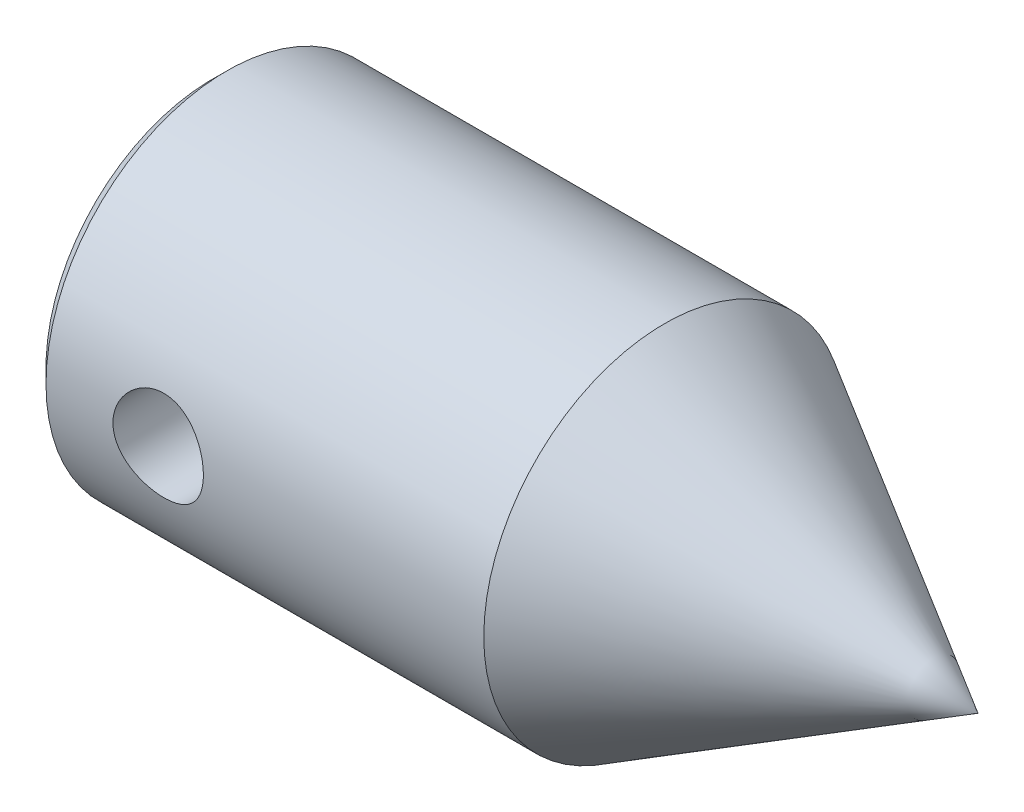
ISO-10303-21;
HEADER;
FILE_DESCRIPTION(('STEP AP214'),'2;1');
FILE_NAME('part.step','',(''),(''),'','','');
FILE_SCHEMA(('AUTOMOTIVE_DESIGN { 1 0 10303 214 1 1 1 1 }'));
ENDSEC;
DATA;
#1=APPLICATION_CONTEXT('core data for automotive mechanical design processes');
#2=APPLICATION_PROTOCOL_DEFINITION('international standard','automotive_design',2000,#1);
#3=PRODUCT_CONTEXT('',#1,'mechanical');
#4=PRODUCT('Part','Part','',(#3));
#5=PRODUCT_RELATED_PRODUCT_CATEGORY('part','',(#4));
#6=PRODUCT_DEFINITION_FORMATION('','',#4);
#7=PRODUCT_DEFINITION_CONTEXT('part definition',#1,'design');
#8=PRODUCT_DEFINITION('design','',#6,#7);
#9=PRODUCT_DEFINITION_SHAPE('','',#8);
#10=(LENGTH_UNIT() NAMED_UNIT(*) SI_UNIT(.MILLI.,.METRE.));
#11=(NAMED_UNIT(*) PLANE_ANGLE_UNIT() SI_UNIT($,.RADIAN.));
#12=(NAMED_UNIT(*) SI_UNIT($,.STERADIAN.) SOLID_ANGLE_UNIT());
#13=UNCERTAINTY_MEASURE_WITH_UNIT(LENGTH_MEASURE(1.E-05),#10,'distance_accuracy_value','');
#14=(GEOMETRIC_REPRESENTATION_CONTEXT(3) GLOBAL_UNCERTAINTY_ASSIGNED_CONTEXT((#13)) GLOBAL_UNIT_ASSIGNED_CONTEXT((#10,
#11,#12)) REPRESENTATION_CONTEXT('',''));
#15=CARTESIAN_POINT('',(0.,0.,0.));
#16=DIRECTION('',(0.,0.,1.));
#17=DIRECTION('',(1.,0.,0.));
#18=AXIS2_PLACEMENT_3D('',#15,#16,#17);
#19=CARTESIAN_POINT('',(0.,0.,0.));
#20=DIRECTION('',(-1.,0.,0.));
#21=DIRECTION('',(0.,0.,1.));
#22=AXIS2_PLACEMENT_3D('',#19,#20,#21);
#23=CYLINDRICAL_SURFACE('',#22,7.9375);
#24=CARTESIAN_POINT('',(1.016,0.,0.));
#25=DIRECTION('',(1.,0.,0.));
#26=DIRECTION('',(0.,0.,-1.));
#27=AXIS2_PLACEMENT_3D('',#24,#25,#26);
#28=CIRCLE('',#27,7.9375);
#29=CARTESIAN_POINT('',(1.016,0.,-7.9375));
#30=VERTEX_POINT('',#29);
#31=EDGE_CURVE('E11',#30,#30,#28,.F.);
#32=ORIENTED_EDGE('',*,*,#31,.T.);
#33=EDGE_LOOP('',(#32));
#34=FACE_BOUND('',#33,.T.);
#35=CARTESIAN_POINT('',(25.4,0.,0.));
#36=DIRECTION('',(-1.,0.,0.));
#37=DIRECTION('',(0.,0.,1.));
#38=AXIS2_PLACEMENT_3D('',#35,#36,#37);
#39=CIRCLE('',#38,7.9375);
#40=CARTESIAN_POINT('',(25.4,0.,7.9375));
#41=VERTEX_POINT('',#40);
#42=EDGE_CURVE('E93',#41,#41,#39,.T.);
#43=ORIENTED_EDGE('',*,*,#42,.F.);
#44=EDGE_LOOP('',(#43));
#45=FACE_BOUND('',#44,.T.);
#46=CARTESIAN_POINT('',(12.065,0.,7.9375));
#47=CARTESIAN_POINT('',(12.0649982950492,-0.0853685543276753,7.9374988249375));
#48=CARTESIAN_POINT('',(12.0615499555497,-0.170766754285778,7.93611748805491));
#49=CARTESIAN_POINT('',(12.0477990093693,-0.340937950036051,7.9306333870349));
#50=CARTESIAN_POINT('',(12.0374920778549,-0.425710517197598,7.92652890576471));
#51=CARTESIAN_POINT('',(11.996344710042,-0.678494093296387,7.91024405172601));
#52=CARTESIAN_POINT('',(11.9552780245151,-0.844717304002153,7.89409269398439));
#53=CARTESIAN_POINT('',(11.8477091089001,-1.16678110877374,7.85295460909391));
#54=CARTESIAN_POINT('',(11.7812901501931,-1.32265375288673,7.82799682735572));
#55=CARTESIAN_POINT('',(11.6252320937711,-1.62094055421135,7.77171078395473));
#56=CARTESIAN_POINT('',(11.5356010564021,-1.76335935985761,7.74038473446993));
#57=CARTESIAN_POINT('',(11.33120113708,-2.03756104036298,7.67287793546994));
#58=CARTESIAN_POINT('',(11.2155181808152,-2.16862471408353,7.63654649529086));
#59=CARTESIAN_POINT('',(10.9642274968852,-2.41010196326798,7.56381162683049));
#60=CARTESIAN_POINT('',(10.8286100788337,-2.52050543588591,7.527408172081));
#61=CARTESIAN_POINT('',(10.5339704378038,-2.72236362018853,7.45684932878625));
#62=CARTESIAN_POINT('',(10.374175203254,-2.81275634807416,7.42286609334558));
#63=CARTESIAN_POINT('',(10.0400859676923,-2.96506055107625,7.3633591466895));
#64=CARTESIAN_POINT('',(9.86579889959094,-3.02698555366352,7.3378314191484));
#65=CARTESIAN_POINT('',(9.5159316703746,-3.11768939850381,7.29974342844104));
#66=CARTESIAN_POINT('',(9.34076866350313,-3.14784417508583,7.28664754820722));
#67=CARTESIAN_POINT('',(8.98741694020683,-3.17844957223633,7.2733535642182));
#68=CARTESIAN_POINT('',(8.80922975481335,-3.17891479977946,7.27314911800113));
#69=CARTESIAN_POINT('',(8.46811128401985,-3.15117062195247,7.28520419164092));
#70=CARTESIAN_POINT('',(8.30498130325892,-3.12495456169026,7.29659727750813));
#71=CARTESIAN_POINT('',(7.98566545473029,-3.0479156721401,7.3291094770303));
#72=CARTESIAN_POINT('',(7.82948080384975,-2.99708854916464,7.35023028776914));
#73=CARTESIAN_POINT('',(7.52472168507455,-2.87130288801851,7.40028182612306));
#74=CARTESIAN_POINT('',(7.37636758301029,-2.79587303145073,7.42936314617456));
#75=CARTESIAN_POINT('',(7.0938773915164,-2.62335400638721,7.49201759759741));
#76=CARTESIAN_POINT('',(6.95974667007038,-2.52625670309061,7.52559241410194));
#77=CARTESIAN_POINT('',(6.6985995555297,-2.30433657664143,7.59661194581105));
#78=CARTESIAN_POINT('',(6.57293464200522,-2.1779507224679,7.63415518150378));
#79=CARTESIAN_POINT('',(6.34415089117099,-1.90549915354342,7.70667472120535));
#80=CARTESIAN_POINT('',(6.24103654411095,-1.75942952871787,7.74165051306754));
#81=CARTESIAN_POINT('',(6.05850730222758,-1.44792327351233,7.80597056507674));
#82=CARTESIAN_POINT('',(5.97960087859973,-1.28216103001268,7.83518991276525));
#83=CARTESIAN_POINT('',(5.85125852053853,-0.938250227703929,7.8837603997185));
#84=CARTESIAN_POINT('',(5.8018076153776,-0.760108012498826,7.90311655121518));
#85=CARTESIAN_POINT('',(5.73651333102123,-0.407822221577447,7.92886621467234));
#86=CARTESIAN_POINT('',(5.71885372887247,-0.234066229202029,7.93595926510707));
#87=CARTESIAN_POINT('',(5.71228045291082,0.1140544293199,7.93858709635623));
#88=CARTESIAN_POINT('',(5.72335932804335,0.288418925992912,7.93412487311887));
#89=CARTESIAN_POINT('',(5.77261315717626,0.624574473356217,7.91460137713708));
#90=CARTESIAN_POINT('',(5.80954829380709,0.786578455693803,7.90002533761017));
#91=CARTESIAN_POINT('',(5.9077791869419,1.10193999204625,7.86224363231233));
#92=CARTESIAN_POINT('',(5.96907807272432,1.25529643248105,7.839036858035));
#93=CARTESIAN_POINT('',(6.11629609174161,1.55428757248493,7.78536344198656));
#94=CARTESIAN_POINT('',(6.20291093686734,1.69954261112768,7.75469645367908));
#95=CARTESIAN_POINT('',(6.39753026420135,1.97396670110043,7.68942716533551));
#96=CARTESIAN_POINT('',(6.50554331814394,2.1031292721953,7.65482329062667));
#97=CARTESIAN_POINT('',(6.74825614555296,2.35064783082209,7.58261624250382));
#98=CARTESIAN_POINT('',(6.88424699712351,2.46772736997036,7.54496588261805));
#99=CARTESIAN_POINT('',(7.17461113179496,2.67771752584103,7.47302405756412));
#100=CARTESIAN_POINT('',(7.32898743810548,2.77062415967416,7.43873314650073));
#101=CARTESIAN_POINT('',(7.65407044010168,2.93021940951752,7.37733951101733));
#102=CARTESIAN_POINT('',(7.82492084850038,2.99664531957733,7.35030964023023));
#103=CARTESIAN_POINT('',(8.17678967234678,3.09927024802884,7.30763831652789));
#104=CARTESIAN_POINT('',(8.3578004776564,3.13549157555361,7.29198845941928));
#105=CARTESIAN_POINT('',(8.71081554320477,3.17454854503857,7.27506417865867));
#106=CARTESIAN_POINT('',(8.88253055474372,3.17959912756792,7.27283630768347));
#107=CARTESIAN_POINT('',(9.22423996473017,3.16198750594215,7.28051052284657));
#108=CARTESIAN_POINT('',(9.39423457889875,3.13932882078029,7.29041106871286));
#109=CARTESIAN_POINT('',(9.72078984027435,3.06875082741637,7.32038555119357));
#110=CARTESIAN_POINT('',(9.87761589492898,3.02186589429123,7.3400416945069));
#111=CARTESIAN_POINT('',(10.1812386152561,2.90513352619813,7.38701853032588));
#112=CARTESIAN_POINT('',(10.3280324975779,2.83527974968518,7.4143413392411));
#113=CARTESIAN_POINT('',(10.6165801100221,2.6699734967195,7.47551538507981));
#114=CARTESIAN_POINT('',(10.7575640237077,2.57328433075138,7.50965084432627));
#115=CARTESIAN_POINT('',(11.022002506371,2.35885187759606,7.57973805685472));
#116=CARTESIAN_POINT('',(11.1454517716982,2.2411022445419,7.61569035523125));
#117=CARTESIAN_POINT('',(11.379519579429,1.97883490457173,7.68815973066453));
#118=CARTESIAN_POINT('',(11.4887873041675,1.83307665558444,7.72456229557385));
#119=CARTESIAN_POINT('',(11.6813694800675,1.52381324145875,7.79145894481047));
#120=CARTESIAN_POINT('',(11.764671861512,1.36029987051438,7.82195027888211));
#121=CARTESIAN_POINT('',(11.8671694551073,1.10690073992766,7.86039859512765));
#122=CARTESIAN_POINT('',(11.8974192350479,1.02187442979533,7.87192833758885));
#123=CARTESIAN_POINT('',(11.9506340216948,0.849282882748177,7.89241101848917));
#124=CARTESIAN_POINT('',(11.9736024252441,0.761718850579005,7.90136515829436));
#125=CARTESIAN_POINT('',(12.01195848277,0.584948829970238,7.91641316871199));
#126=CARTESIAN_POINT('',(12.0273653588376,0.495747609248915,7.92251429007144));
#127=CARTESIAN_POINT('',(12.0505046992044,0.316245461129481,7.93170572455018));
#128=CARTESIAN_POINT('',(12.058242618132,0.225945361663258,7.9347981775885));
#129=CARTESIAN_POINT('',(12.0640364090956,0.0903530971558211,7.93711466317073));
#130=CARTESIAN_POINT('',(12.0650009023331,0.0451807004193512,7.93750062189347));
#131=CARTESIAN_POINT('',(12.065,0.,7.9375));
#132=B_SPLINE_CURVE_WITH_KNOTS('',3,(#46,#47,#48,#49,#50,#51,#52,#53,#54,#55,#56,#57,#58,#59,
#60,#61,#62,#63,#64,#65,#66,#67,#68,#69,#70,#71,#72,#73,#74,#75,#76,#77,#78,#79,#80,#81,#82,#83,
#84,#85,#86,#87,#88,#89,#90,#91,#92,#93,#94,#95,#96,#97,#98,#99,#100,#101,#102,#103,#104,#105,
#106,#107,#108,#109,#110,#111,#112,#113,#114,#115,#116,#117,#118,#119,#120,#121,#122,#123,#124,
#125,#126,#127,#128,#129,#130,#131),.UNSPECIFIED.,.T.,.F.,(4,2,2,2,2,2,2,2,2,2,2,2,2,2,2,2,2,2,
2,2,2,2,2,2,2,2,2,2,2,2,2,2,2,2,2,2,2,2,2,2,2,2,4),(0.,0.256066919778835,0.51229546129927,
1.02550349018162,1.53704015675516,2.04839943091077,2.58171415251282,3.1152889876028,
3.67261045177409,4.22966681002153,4.76145838979668,5.29298833117427,5.78752668142709,
6.28215134077757,6.78687059808153,7.29177966635648,7.83571951142441,8.37976756691858,
8.93456421454737,9.48907864639424,10.0107665224699,10.5323191535129,11.0304379501721,
11.5286207458643,12.0420414932852,12.555668325134,13.1032052527504,13.6508323391573,
14.2037645596985,14.756288021342,15.2690505331977,15.7817479325262,16.2741705250495,
16.7667291864948,17.2874900234878,17.8084080394936,18.3630999416875,18.9180493033813,
19.1906927530865,19.4632088237851,19.7350284985653,20.0066546996234,20.1421762963161),.UNSPECIFIED.);
#133=CARTESIAN_POINT('',(12.065,0.,7.9375));
#134=VERTEX_POINT('',#133);
#135=EDGE_CURVE('E77',#134,#134,#132,.T.);
#136=ORIENTED_EDGE('',*,*,#135,.F.);
#137=EDGE_LOOP('',(#136));
#138=FACE_BOUND('',#137,.T.);
#139=ADVANCED_FACE('F33',(#34,#45,#138),#23,.F.);
#140=CARTESIAN_POINT('',(0.,0.,0.));
#141=DIRECTION('',(-1.,0.,0.));
#142=DIRECTION('',(0.,0.,1.));
#143=AXIS2_PLACEMENT_3D('',#140,#141,#142);
#144=CYLINDRICAL_SURFACE('',#143,12.7);
#145=CARTESIAN_POINT('',(1.01599999999999,0.,0.));
#146=DIRECTION('',(1.,0.,0.));
#147=DIRECTION('',(0.,0.,-1.));
#148=AXIS2_PLACEMENT_3D('',#145,#146,#147);
#149=CIRCLE('',#148,12.7);
#150=CARTESIAN_POINT('',(1.01599999999999,0.,-12.7));
#151=VERTEX_POINT('',#150);
#152=EDGE_CURVE('E41',#151,#151,#149,.T.);
#153=ORIENTED_EDGE('',*,*,#152,.T.);
#154=EDGE_LOOP('',(#153));
#155=FACE_BOUND('',#154,.T.);
#156=CARTESIAN_POINT('',(31.75,0.,0.));
#157=DIRECTION('',(-1.,0.,0.));
#158=DIRECTION('',(0.,0.,1.));
#159=AXIS2_PLACEMENT_3D('',#156,#157,#158);
#160=CIRCLE('',#159,12.7);
#161=CARTESIAN_POINT('',(31.75,0.,12.7));
#162=VERTEX_POINT('',#161);
#163=EDGE_CURVE('E82',#162,#162,#160,.T.);
#164=ORIENTED_EDGE('',*,*,#163,.T.);
#165=EDGE_LOOP('',(#164));
#166=FACE_BOUND('',#165,.T.);
#167=CARTESIAN_POINT('',(5.715,0.,12.7));
#168=CARTESIAN_POINT('',(5.71500492281243,-0.175421054350931,12.6999970338729));
#169=CARTESIAN_POINT('',(5.72958711580452,-0.350897100741782,12.6963292371237));
#170=CARTESIAN_POINT('',(5.78744323693316,-0.696820051980961,12.6820530760661));
#171=CARTESIAN_POINT('',(5.83073342685512,-0.867264049209732,12.6714407780562));
#172=CARTESIAN_POINT('',(5.94452975316141,-1.19807751278645,12.6444507573613));
#173=CARTESIAN_POINT('',(6.01500320728065,-1.35845880926017,12.6280799601569));
#174=CARTESIAN_POINT('',(6.18105060892825,-1.66512267919771,12.591316443928));
#175=CARTESIAN_POINT('',(6.27662540311848,-1.81140477687155,12.5709235892463));
#176=CARTESIAN_POINT('',(6.49224167143468,-2.08873074612027,12.5278602543575));
#177=CARTESIAN_POINT('',(6.61270283366334,-2.2194428772959,12.5051546346353));
#178=CARTESIAN_POINT('',(6.87377383372412,-2.45903522924703,12.4602582924963));
#179=CARTESIAN_POINT('',(7.01438594357101,-2.56791298487579,12.4380676284689));
#180=CARTESIAN_POINT('',(7.31434322992663,-2.76230618225783,12.3963594189446));
#181=CARTESIAN_POINT('',(7.47393567187847,-2.84745052370821,12.3768864828385));
#182=CARTESIAN_POINT('',(7.80573413801374,-2.98957345643241,12.343330973648));
#183=CARTESIAN_POINT('',(7.97793814055276,-3.04655655068163,12.3292475388652));
#184=CARTESIAN_POINT('',(8.32642373786018,-3.12960773790342,12.3084267567388));
#185=CARTESIAN_POINT('',(8.50255452994708,-3.15627230130285,12.3015478927701));
#186=CARTESIAN_POINT('',(8.85691347104861,-3.17978742389057,12.2954915053947));
#187=CARTESIAN_POINT('',(9.03514127413169,-3.176642833515,12.2963127290578));
#188=CARTESIAN_POINT('',(9.38406345972766,-3.14110481048738,12.3054365167726));
#189=CARTESIAN_POINT('',(9.55483573210161,-3.10942215340351,12.3135572669877));
#190=CARTESIAN_POINT('',(9.88856089109507,-3.01884119561134,12.3360753547043));
#191=CARTESIAN_POINT('',(10.0515132197445,-2.95994095604688,12.3504731393489));
#192=CARTESIAN_POINT('',(10.366878801067,-2.81599106163371,12.3840899110031));
#193=CARTESIAN_POINT('',(10.5191690636213,-2.73068344564301,12.4033560981111));
#194=CARTESIAN_POINT('',(10.8075279356519,-2.53652078423164,12.4445122129068));
#195=CARTESIAN_POINT('',(10.9435937000757,-2.42766161831204,12.4664025994163));
#196=CARTESIAN_POINT('',(11.1997143198865,-2.18580424890858,12.5111061380944));
#197=CARTESIAN_POINT('',(11.3192020039632,-2.05220624645107,12.533927803951));
#198=CARTESIAN_POINT('',(11.5341849632153,-1.76659522538283,12.5773596047503));
#199=CARTESIAN_POINT('',(11.6296795055245,-1.61458164448182,12.5979696721291));
#200=CARTESIAN_POINT('',(11.7941737408416,-1.29564529770895,12.6347586626604));
#201=CARTESIAN_POINT('',(11.8630813035385,-1.12867311562492,12.6509221227036));
#202=CARTESIAN_POINT('',(11.9716916304186,-0.785020883902436,12.676884242985));
#203=CARTESIAN_POINT('',(12.0113999810851,-0.608342698201861,12.6866841206814));
#204=CARTESIAN_POINT('',(12.0596185137662,-0.255142937325559,12.6986347345774));
#205=CARTESIAN_POINT('',(12.0689010718594,-0.0787330573083795,12.7009747992585));
#206=CARTESIAN_POINT('',(12.0581229456492,0.273119584996525,12.6982813685726));
#207=CARTESIAN_POINT('',(12.0380649027418,0.448562432914394,12.6932485369526));
#208=CARTESIAN_POINT('',(11.9698115772383,0.790816868910237,12.6764961338622));
#209=CARTESIAN_POINT('',(11.9220376589737,0.95771783515052,12.6648767569325));
#210=CARTESIAN_POINT('',(11.8001900054731,1.28112793569116,12.6362609570897));
#211=CARTESIAN_POINT('',(11.7261136142037,1.43763601861911,12.6192639911647));
#212=CARTESIAN_POINT('',(11.5522668605486,1.73889063454314,12.5813250177716));
#213=CARTESIAN_POINT('',(11.4520638954273,1.88337918521903,12.5603183592593));
#214=CARTESIAN_POINT('',(11.2293613597127,2.15376466554501,12.5167921111412));
#215=CARTESIAN_POINT('',(11.1068579411427,2.27965837982672,12.4942722608556));
#216=CARTESIAN_POINT('',(10.8394458495475,2.51246336908675,12.4495762556412));
#217=CARTESIAN_POINT('',(10.6940610286508,2.6188328531313,12.4274221051899));
#218=CARTESIAN_POINT('',(10.3870492570416,2.80566443991221,12.3865825924258));
#219=CARTESIAN_POINT('',(10.225423027713,2.88612769264178,12.3678970761538));
#220=CARTESIAN_POINT('',(9.89138288757303,3.0182638402854,12.3363163381503));
#221=CARTESIAN_POINT('',(9.71903985340403,3.07010730622843,12.3233869021911));
#222=CARTESIAN_POINT('',(9.36771126654123,3.14398164687971,12.3047494152553));
#223=CARTESIAN_POINT('',(9.18872717534393,3.16601904149253,12.299039785006));
#224=CARTESIAN_POINT('',(8.8347104994796,3.17931501621074,12.2956087422145));
#225=CARTESIAN_POINT('',(8.65971209561251,3.17143955029538,12.2976625750886));
#226=CARTESIAN_POINT('',(8.31362343562374,3.1271152390873,12.3090074061494));
#227=CARTESIAN_POINT('',(8.1425331010331,3.09066696801937,12.3182982588945));
#228=CARTESIAN_POINT('',(7.81005876165632,2.9907046261569,12.3429450180984));
#229=CARTESIAN_POINT('',(7.64862303724463,2.92735297324093,12.3582644892528));
#230=CARTESIAN_POINT('',(7.33855660658629,2.7755107337966,12.3932474960913));
#231=CARTESIAN_POINT('',(7.18992768008686,2.68701666057215,12.4129116342002));
#232=CARTESIAN_POINT('',(6.90550936861324,2.4846867346155,12.4550092586011));
#233=CARTESIAN_POINT('',(6.77015606125285,2.37025002816433,12.4775016056118));
#234=CARTESIAN_POINT('',(6.52029208851616,2.12045416901821,12.5223699100401));
#235=CARTESIAN_POINT('',(6.40578637959415,1.98509005500274,12.5447458385544));
#236=CARTESIAN_POINT('',(6.19884606353831,1.6943230585205,12.5873437112106));
#237=CARTESIAN_POINT('',(6.10684873439517,1.53860166056969,12.6075193062447));
#238=CARTESIAN_POINT('',(5.95048453677586,1.21341315929717,12.6429542453062));
#239=CARTESIAN_POINT('',(5.88609786996059,1.04395600927443,12.6582171100619));
#240=CARTESIAN_POINT('',(5.79633962580224,0.729001702698684,12.6798505941374));
#241=CARTESIAN_POINT('',(5.76590320220356,0.585004695088747,12.6873547169486));
#242=CARTESIAN_POINT('',(5.72523208600022,0.294017851418467,12.6974304774096));
#243=CARTESIAN_POINT('',(5.71499587397044,0.147028241296872,12.7000024860439));
#244=CARTESIAN_POINT('',(5.715,0.,12.7));
#245=B_SPLINE_CURVE_WITH_KNOTS('',3,(#167,#168,#169,#170,#171,#172,#173,#174,#175,#176,#177,
#178,#179,#180,#181,#182,#183,#184,#185,#186,#187,#188,#189,#190,#191,#192,#193,#194,#195,#196,
#197,#198,#199,#200,#201,#202,#203,#204,#205,#206,#207,#208,#209,#210,#211,#212,#213,#214,#215,
#216,#217,#218,#219,#220,#221,#222,#223,#224,#225,#226,#227,#228,#229,#230,#231,#232,#233,#234,
#235,#236,#237,#238,#239,#240,#241,#242,#243,#244),.UNSPECIFIED.,.T.,.F.,(4,2,2,2,2,2,2,2,2,2,2,
2,2,2,2,2,2,2,2,2,2,2,2,2,2,2,2,2,2,2,2,2,2,2,2,2,2,2,4),(0.,0.5257243580655,1.05174676993359,
1.57713870983892,2.10254837335841,2.63767221675277,3.17285644277798,3.71599137305291,
4.25903942808496,4.79120824630598,5.32329047345571,5.84247618671884,6.36169889010143,
6.8861628400674,7.41071862276906,7.9502317705812,8.48976139571985,9.0311441807632,
9.57242335981323,10.09985087283,10.6272309069567,11.1467958106174,11.6664131950588,
12.1952509368702,12.7241800170734,13.266092111565,13.8079801469349,14.34660272276,
14.8851074589671,15.4081433519175,15.9311687337377,16.4510804786766,16.9710643590661,
17.5046127008448,18.0382877269755,18.5816279265763,19.1245778677202,19.5652441424438,
20.005877269746),.UNSPECIFIED.);
#246=CARTESIAN_POINT('',(5.715,0.,12.7));
#247=VERTEX_POINT('',#246);
#248=EDGE_CURVE('E87',#247,#247,#245,.T.);
#249=ORIENTED_EDGE('',*,*,#248,.F.);
#250=EDGE_LOOP('',(#249));
#251=FACE_BOUND('',#250,.T.);
#252=ADVANCED_FACE('F66',(#155,#166,#251),#144,.T.);
#253=CARTESIAN_POINT('',(25.4,0.,0.));
#254=DIRECTION('',(-1.,0.,0.));
#255=DIRECTION('',(0.,0.,1.));
#256=AXIS2_PLACEMENT_3D('',#253,#254,#255);
#257=CONICAL_SURFACE('',#256,7.9375,0.78539816339745);
#258=CARTESIAN_POINT('',(33.3375,0.,0.));
#259=VERTEX_POINT('',#258);
#260=VERTEX_LOOP('',#259);
#261=FACE_BOUND('',#260,.T.);
#262=ORIENTED_EDGE('',*,*,#42,.T.);
#263=EDGE_LOOP('',(#262));
#264=FACE_BOUND('',#263,.T.);
#265=ADVANCED_FACE('F60',(#261,#264),#257,.F.);
#266=CARTESIAN_POINT('',(0.,12.7,0.));
#267=DIRECTION('',(1.,0.,0.));
#268=DIRECTION('',(0.,0.,-1.));
#269=AXIS2_PLACEMENT_3D('',#266,#267,#268);
#270=PLANE('',#269);
#271=CARTESIAN_POINT('',(0.,0.,0.));
#272=DIRECTION('',(1.,0.,0.));
#273=DIRECTION('',(0.,0.,-1.));
#274=AXIS2_PLACEMENT_3D('',#271,#272,#273);
#275=CIRCLE('',#274,11.684);
#276=CARTESIAN_POINT('',(0.,0.,-11.684));
#277=VERTEX_POINT('',#276);
#278=EDGE_CURVE('E97',#277,#277,#275,.F.);
#279=ORIENTED_EDGE('',*,*,#278,.T.);
#280=EDGE_LOOP('',(#279));
#281=FACE_BOUND('',#280,.T.);
#282=CARTESIAN_POINT('',(0.,0.,0.));
#283=DIRECTION('',(1.,0.,0.));
#284=DIRECTION('',(0.,0.,-1.));
#285=AXIS2_PLACEMENT_3D('',#282,#283,#284);
#286=CIRCLE('',#285,8.9535);
#287=CARTESIAN_POINT('',(0.,0.,-8.9535));
#288=VERTEX_POINT('',#287);
#289=EDGE_CURVE('E92',#288,#288,#286,.T.);
#290=ORIENTED_EDGE('',*,*,#289,.T.);
#291=EDGE_LOOP('',(#290));
#292=FACE_BOUND('',#291,.T.);
#293=ADVANCED_FACE('F50',(#281,#292),#270,.F.);
#294=CARTESIAN_POINT('',(53.7470452561247,0.,0.));
#295=DIRECTION('',(-1.,0.,0.));
#296=DIRECTION('',(0.,0.,1.));
#297=AXIS2_PLACEMENT_3D('',#294,#295,#296);
#298=CONICAL_SURFACE('',#297,0.,0.5235987755983);
#299=ORIENTED_EDGE('',*,*,#163,.F.);
#300=EDGE_LOOP('',(#299));
#301=FACE_BOUND('',#300,.T.);
#302=CARTESIAN_POINT('',(53.7470452561247,0.,0.));
#303=VERTEX_POINT('',#302);
#304=VERTEX_LOOP('',#303);
#305=FACE_BOUND('',#304,.T.);
#306=ADVANCED_FACE('F47',(#301,#305),#298,.T.);
#307=CARTESIAN_POINT('',(8.89,0.,12.7));
#308=DIRECTION('',(0.,0.,-1.));
#309=DIRECTION('',(-1.,0.,0.));
#310=AXIS2_PLACEMENT_3D('',#307,#308,#309);
#311=CYLINDRICAL_SURFACE('',#310,3.175);
#312=ORIENTED_EDGE('',*,*,#248,.T.);
#313=EDGE_LOOP('',(#312));
#314=FACE_BOUND('',#313,.T.);
#315=ORIENTED_EDGE('',*,*,#135,.T.);
#316=EDGE_LOOP('',(#315));
#317=FACE_BOUND('',#316,.T.);
#318=ADVANCED_FACE('F49',(#314,#317),#311,.F.);
#319=CARTESIAN_POINT('',(0.,0.,0.));
#320=DIRECTION('',(1.,0.,0.));
#321=DIRECTION('',(0.,0.,-1.));
#322=AXIS2_PLACEMENT_3D('',#319,#320,#321);
#323=CONICAL_SURFACE('',#322,11.684,0.785398163397447);
#324=ORIENTED_EDGE('',*,*,#152,.F.);
#325=EDGE_LOOP('',(#324));
#326=FACE_BOUND('',#325,.T.);
#327=ORIENTED_EDGE('',*,*,#278,.F.);
#328=EDGE_LOOP('',(#327));
#329=FACE_BOUND('',#328,.T.);
#330=ADVANCED_FACE('F57',(#326,#329),#323,.T.);
#331=CARTESIAN_POINT('',(1.016,0.,0.));
#332=DIRECTION('',(-1.,0.,0.));
#333=DIRECTION('',(0.,0.,1.));
#334=AXIS2_PLACEMENT_3D('',#331,#332,#333);
#335=CONICAL_SURFACE('',#334,7.9375,0.785398163397448);
#336=ORIENTED_EDGE('',*,*,#289,.F.);
#337=EDGE_LOOP('',(#336));
#338=FACE_BOUND('',#337,.T.);
#339=ORIENTED_EDGE('',*,*,#31,.F.);
#340=EDGE_LOOP('',(#339));
#341=FACE_BOUND('',#340,.T.);
#342=ADVANCED_FACE('F35',(#338,#341),#335,.F.);
#343=CLOSED_SHELL('',(#139,#252,#265,#293,#306,#318,#330,#342));
#344=MANIFOLD_SOLID_BREP('B2',#343);
#345=ADVANCED_BREP_SHAPE_REPRESENTATION('',(#18,#344),#14);
#346=SHAPE_DEFINITION_REPRESENTATION(#9,#345);
ENDSEC;
END-ISO-10303-21;
